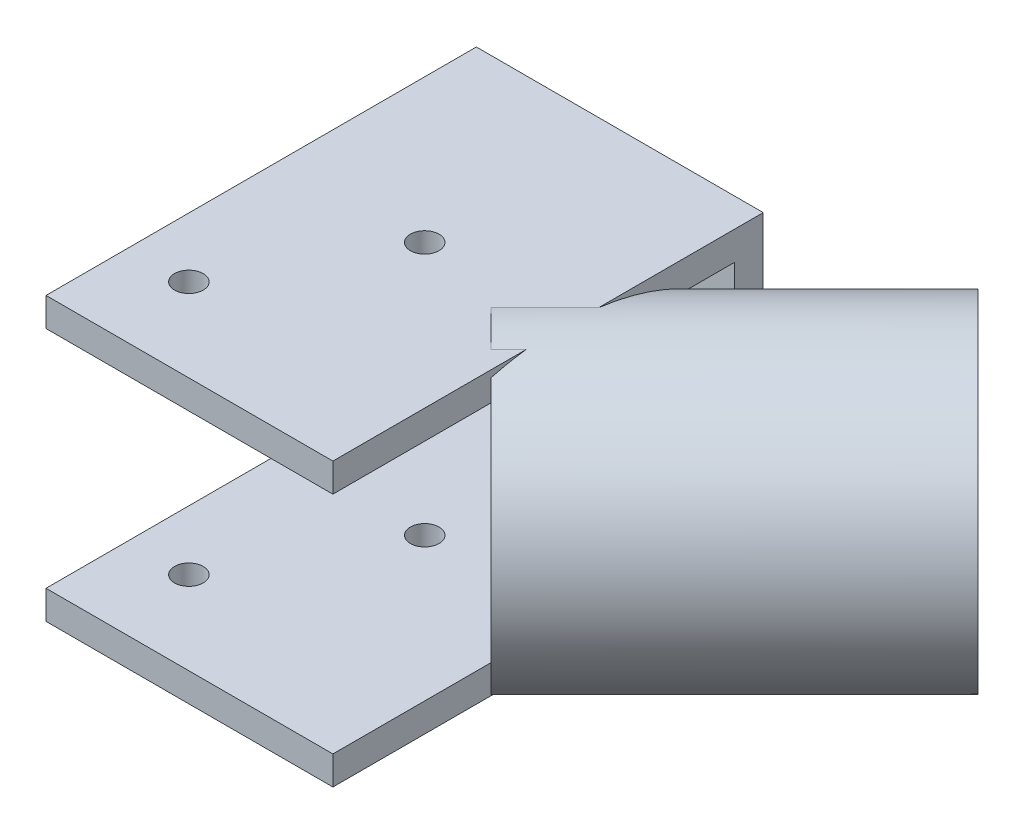
ISO-10303-21;
HEADER;
FILE_DESCRIPTION(('STEP AP214'),'2;1');
FILE_NAME('part.step','',(''),(''),'','','');
FILE_SCHEMA(('AUTOMOTIVE_DESIGN { 1 0 10303 214 1 1 1 1 }'));
ENDSEC;
DATA;
#1=APPLICATION_CONTEXT('core data for automotive mechanical design processes');
#2=APPLICATION_PROTOCOL_DEFINITION('international standard','automotive_design',2000,#1);
#3=PRODUCT_CONTEXT('',#1,'mechanical');
#4=PRODUCT('Part','Part','',(#3));
#5=PRODUCT_RELATED_PRODUCT_CATEGORY('part','',(#4));
#6=PRODUCT_DEFINITION_FORMATION('','',#4);
#7=PRODUCT_DEFINITION_CONTEXT('part definition',#1,'design');
#8=PRODUCT_DEFINITION('design','',#6,#7);
#9=PRODUCT_DEFINITION_SHAPE('','',#8);
#10=(LENGTH_UNIT() NAMED_UNIT(*) SI_UNIT(.MILLI.,.METRE.));
#11=(NAMED_UNIT(*) PLANE_ANGLE_UNIT() SI_UNIT($,.RADIAN.));
#12=(NAMED_UNIT(*) SI_UNIT($,.STERADIAN.) SOLID_ANGLE_UNIT());
#13=UNCERTAINTY_MEASURE_WITH_UNIT(LENGTH_MEASURE(1.E-05),#10,'distance_accuracy_value','');
#14=(GEOMETRIC_REPRESENTATION_CONTEXT(3) GLOBAL_UNCERTAINTY_ASSIGNED_CONTEXT((#13)) GLOBAL_UNIT_ASSIGNED_CONTEXT((#10,
#11,#12)) REPRESENTATION_CONTEXT('',''));
#15=CARTESIAN_POINT('',(0.,0.,0.));
#16=DIRECTION('',(0.,0.,1.));
#17=DIRECTION('',(1.,0.,0.));
#18=AXIS2_PLACEMENT_3D('',#15,#16,#17);
#19=CARTESIAN_POINT('',(43.7961985270279,24.6,41.2226053982207));
#20=DIRECTION('',(-0.707106781186547,0.,0.707106781186548));
#21=DIRECTION('',(0.707106781186548,0.,0.707106781186547));
#22=AXIS2_PLACEMENT_3D('',#19,#20,#21);
#23=PLANE('',#22);
#24=DIRECTION('',(0.,1.,0.));
#25=VECTOR('',#24,1.);
#26=CARTESIAN_POINT('',(50.,0.,47.4264068711929));
#27=LINE('',#26,#25);
#28=CARTESIAN_POINT('',(50.,44.2,47.4264068711929));
#29=VERTEX_POINT('',#28);
#30=CARTESIAN_POINT('',(50.,48.0099486237774,47.4264068711929));
#31=VERTEX_POINT('',#30);
#32=EDGE_CURVE('E186',#29,#31,#27,.T.);
#33=ORIENTED_EDGE('',*,*,#32,.F.);
#34=DIRECTION('',(0.,-1.,0.));
#35=VECTOR('',#34,1.);
#36=CARTESIAN_POINT('',(50.,24.6,47.4264068711929));
#37=LINE('',#36,#35);
#38=CARTESIAN_POINT('',(50.,36.7665810550005,47.4264068711928));
#39=VERTEX_POINT('',#38);
#40=EDGE_CURVE('E174',#29,#39,#37,.T.);
#41=ORIENTED_EDGE('',*,*,#40,.T.);
#42=CARTESIAN_POINT('',(43.7961985270279,24.6,41.2226053982207));
#43=DIRECTION('',(-0.707106781186547,0.,0.707106781186548));
#44=DIRECTION('',(0.707106781186548,0.,0.707106781186547));
#45=AXIS2_PLACEMENT_3D('',#42,#43,#44);
#46=CIRCLE('',#45,15.);
#47=CARTESIAN_POINT('',(50.,12.4334189449995,47.4264068711928));
#48=VERTEX_POINT('',#47);
#49=EDGE_CURVE('E173',#48,#39,#46,.T.);
#50=ORIENTED_EDGE('',*,*,#49,.F.);
#51=CARTESIAN_POINT('',(50.,5.,47.4264068711929));
#52=VERTEX_POINT('',#51);
#53=EDGE_CURVE('E47',#48,#52,#37,.T.);
#54=ORIENTED_EDGE('',*,*,#53,.T.);
#55=CARTESIAN_POINT('',(50.,1.19005137622258,47.4264068711929));
#56=VERTEX_POINT('',#55);
#57=EDGE_CURVE('E169',#56,#52,#27,.T.);
#58=ORIENTED_EDGE('',*,*,#57,.F.);
#59=CARTESIAN_POINT('',(43.7961985270279,24.6,41.2226053982207));
#60=DIRECTION('',(-0.707106781186547,0.,0.707106781186548));
#61=DIRECTION('',(0.707106781186548,0.,0.707106781186547));
#62=AXIS2_PLACEMENT_3D('',#59,#60,#61);
#63=CIRCLE('',#62,25.);
#64=EDGE_CURVE('E340',#56,#31,#63,.T.);
#65=ORIENTED_EDGE('',*,*,#64,.T.);
#66=EDGE_LOOP('',(#33,#41,#50,#54,#58,#65));
#67=FACE_BOUND('',#66,.T.);
#68=ADVANCED_FACE('F32',(#67),#23,.T.);
#69=CARTESIAN_POINT('',(43.7961985270279,24.6,41.2226053982207));
#70=DIRECTION('',(0.707106781186547,0.,-0.707106781186548));
#71=DIRECTION('',(-0.707106781186548,0.,-0.707106781186547));
#72=AXIS2_PLACEMENT_3D('',#69,#70,#71);
#73=CYLINDRICAL_SURFACE('',#72,25.);
#74=CARTESIAN_POINT('',(86.2226053982207,24.6,-1.20380147297211));
#75=DIRECTION('',(-0.707106781186547,0.,0.707106781186548));
#76=DIRECTION('',(0.707106781186548,0.,0.707106781186547));
#77=AXIS2_PLACEMENT_3D('',#74,#75,#76);
#78=CIRCLE('',#77,25.);
#79=CARTESIAN_POINT('',(103.900274927884,24.6,16.4738680566916));
#80=VERTEX_POINT('',#79);
#81=EDGE_CURVE('E382',#80,#80,#78,.T.);
#82=ORIENTED_EDGE('',*,*,#81,.T.);
#83=EDGE_LOOP('',(#82));
#84=FACE_BOUND('',#83,.T.);
#85=CARTESIAN_POINT('',(50.,24.6,35.0188039252486));
#86=DIRECTION('',(-1.,0.,0.));
#87=DIRECTION('',(0.,0.,-1.));
#88=AXIS2_PLACEMENT_3D('',#85,#86,#87);
#89=ELLIPSE('',#88,35.3553390593274,25.);
#90=CARTESIAN_POINT('',(50.,11.3925889952368,5.));
#91=VERTEX_POINT('',#90);
#92=CARTESIAN_POINT('',(50.,5.,13.0715945354424));
#93=VERTEX_POINT('',#92);
#94=EDGE_CURVE('E157',#91,#93,#89,.T.);
#95=ORIENTED_EDGE('',*,*,#94,.F.);
#96=CARTESIAN_POINT('',(50.,24.6,35.0188039252486));
#97=DIRECTION('',(-1.,0.,0.));
#98=DIRECTION('',(0.,0.,-1.));
#99=AXIS2_PLACEMENT_3D('',#96,#97,#98);
#100=ELLIPSE('',#99,35.3553390593274,25.);
#101=CARTESIAN_POINT('',(50.,21.1588249357965,0.));
#102=VERTEX_POINT('',#101);
#103=EDGE_CURVE('E359',#91,#102,#100,.F.);
#104=ORIENTED_EDGE('',*,*,#103,.T.);
#105=CARTESIAN_POINT('',(85.0188039252486,24.6,0.));
#106=DIRECTION('',(0.,0.,-1.));
#107=DIRECTION('',(1.,0.,0.));
#108=AXIS2_PLACEMENT_3D('',#105,#106,#107);
#109=ELLIPSE('',#108,35.3553390593274,25.);
#110=CARTESIAN_POINT('',(50.,28.0411750642035,0.));
#111=VERTEX_POINT('',#110);
#112=EDGE_CURVE('E363',#111,#102,#109,.F.);
#113=ORIENTED_EDGE('',*,*,#112,.F.);
#114=CARTESIAN_POINT('',(50.,37.8074110047632,5.));
#115=VERTEX_POINT('',#114);
#116=EDGE_CURVE('E346',#111,#115,#100,.F.);
#117=ORIENTED_EDGE('',*,*,#116,.T.);
#118=CARTESIAN_POINT('',(50.,44.2,13.0715945354424));
#119=VERTEX_POINT('',#118);
#120=EDGE_CURVE('E389',#119,#115,#89,.T.);
#121=ORIENTED_EDGE('',*,*,#120,.F.);
#122=CARTESIAN_POINT('',(50.,49.2,28.7195976260391));
#123=VERTEX_POINT('',#122);
#124=EDGE_CURVE('E352',#119,#123,#100,.F.);
#125=ORIENTED_EDGE('',*,*,#124,.T.);
#126=DIRECTION('',(0.707106781186547,0.,-0.707106781186548));
#127=VECTOR('',#126,1.);
#128=CARTESIAN_POINT('',(40.6465953774231,49.2,38.073002248616));
#129=LINE('',#128,#127);
#130=CARTESIAN_POINT('',(40.6465953774231,49.2,38.073002248616));
#131=VERTEX_POINT('',#130);
#132=EDGE_CURVE('E358',#123,#131,#129,.F.);
#133=ORIENTED_EDGE('',*,*,#132,.T.);
#134=CARTESIAN_POINT('',(46.9458016766327,49.2,44.3722085478255));
#135=VERTEX_POINT('',#134);
#136=EDGE_CURVE('E351',#135,#131,#63,.T.);
#137=ORIENTED_EDGE('',*,*,#136,.F.);
#138=DIRECTION('',(0.707106781186547,0.,-0.707106781186548));
#139=VECTOR('',#138,1.);
#140=CARTESIAN_POINT('',(46.9458016766327,49.2,44.3722085478255));
#141=LINE('',#140,#139);
#142=CARTESIAN_POINT('',(50.,49.2,41.3180102244582));
#143=VERTEX_POINT('',#142);
#144=EDGE_CURVE('E345',#135,#143,#141,.T.);
#145=ORIENTED_EDGE('',*,*,#144,.T.);
#146=EDGE_CURVE('E341',#143,#31,#100,.F.);
#147=ORIENTED_EDGE('',*,*,#146,.T.);
#148=ORIENTED_EDGE('',*,*,#64,.F.);
#149=CARTESIAN_POINT('',(50.,0.,41.3180102244581));
#150=VERTEX_POINT('',#149);
#151=EDGE_CURVE('E185',#56,#150,#100,.F.);
#152=ORIENTED_EDGE('',*,*,#151,.T.);
#153=DIRECTION('',(0.707106781186547,0.,-0.707106781186548));
#154=VECTOR('',#153,1.);
#155=CARTESIAN_POINT('',(46.9458016766326,0.,44.3722085478255));
#156=LINE('',#155,#154);
#157=CARTESIAN_POINT('',(46.9458016766326,0.,44.3722085478255));
#158=VERTEX_POINT('',#157);
#159=EDGE_CURVE('E187',#150,#158,#156,.F.);
#160=ORIENTED_EDGE('',*,*,#159,.T.);
#161=CARTESIAN_POINT('',(40.6465953774232,0.,38.073002248616));
#162=VERTEX_POINT('',#161);
#163=EDGE_CURVE('E355',#162,#158,#63,.T.);
#164=ORIENTED_EDGE('',*,*,#163,.F.);
#165=DIRECTION('',(0.707106781186547,0.,-0.707106781186548));
#166=VECTOR('',#165,1.);
#167=CARTESIAN_POINT('',(40.6465953774232,0.,38.073002248616));
#168=LINE('',#167,#166);
#169=CARTESIAN_POINT('',(50.,0.,28.7195976260392));
#170=VERTEX_POINT('',#169);
#171=EDGE_CURVE('E350',#162,#170,#168,.T.);
#172=ORIENTED_EDGE('',*,*,#171,.T.);
#173=EDGE_CURVE('E343',#170,#93,#100,.F.);
#174=ORIENTED_EDGE('',*,*,#173,.T.);
#175=EDGE_LOOP('',(#95,#104,#113,#117,#121,#125,#133,#137,#145,#147,#148,#152,#160,#164,#172,#174));
#176=FACE_BOUND('',#175,.T.);
#177=ADVANCED_FACE('F336',(#84,#176),#73,.T.);
#178=CARTESIAN_POINT('',(43.7961985270279,24.6,41.2226053982207));
#179=DIRECTION('',(0.707106781186547,0.,-0.707106781186548));
#180=DIRECTION('',(-0.707106781186548,0.,-0.707106781186547));
#181=AXIS2_PLACEMENT_3D('',#178,#179,#180);
#182=CYLINDRICAL_SURFACE('',#181,15.);
#183=CARTESIAN_POINT('',(86.2226053982207,24.6,-1.20380147297211));
#184=DIRECTION('',(-0.707106781186547,0.,0.707106781186548));
#185=DIRECTION('',(0.707106781186548,0.,0.707106781186547));
#186=AXIS2_PLACEMENT_3D('',#183,#184,#185);
#187=CIRCLE('',#186,15.);
#188=CARTESIAN_POINT('',(96.8292071160189,24.6,9.4028002448261));
#189=VERTEX_POINT('',#188);
#190=EDGE_CURVE('E385',#189,#189,#187,.T.);
#191=ORIENTED_EDGE('',*,*,#190,.F.);
#192=EDGE_LOOP('',(#191));
#193=FACE_BOUND('',#192,.T.);
#194=ORIENTED_EDGE('',*,*,#49,.T.);
#195=CARTESIAN_POINT('',(50.,24.6,35.0188039252486));
#196=DIRECTION('',(-1.,0.,0.));
#197=DIRECTION('',(0.,0.,-1.));
#198=AXIS2_PLACEMENT_3D('',#195,#196,#197);
#199=ELLIPSE('',#198,21.2132034355964,15.);
#200=EDGE_CURVE('E11',#39,#48,#199,.T.);
#201=ORIENTED_EDGE('',*,*,#200,.T.);
#202=EDGE_LOOP('',(#194,#201));
#203=FACE_BOUND('',#202,.T.);
#204=ADVANCED_FACE('F426',(#193,#203),#182,.F.);
#205=CARTESIAN_POINT('',(0.,0.,5.));
#206=DIRECTION('',(0.,1.,0.));
#207=DIRECTION('',(0.,0.,1.));
#208=AXIS2_PLACEMENT_3D('',#205,#206,#207);
#209=PLANE('',#208);
#210=CARTESIAN_POINT('',(25.,0.,34.));
#211=DIRECTION('',(0.,1.,0.));
#212=DIRECTION('',(0.,0.,1.));
#213=AXIS2_PLACEMENT_3D('',#210,#211,#212);
#214=CIRCLE('',#213,2.5);
#215=CARTESIAN_POINT('',(25.,0.,36.5));
#216=VERTEX_POINT('',#215);
#217=EDGE_CURVE('E280',#216,#216,#214,.T.);
#218=ORIENTED_EDGE('',*,*,#217,.T.);
#219=EDGE_LOOP('',(#218));
#220=FACE_BOUND('',#219,.T.);
#221=CARTESIAN_POINT('',(10.4,0.,60.5));
#222=DIRECTION('',(0.,-1.,0.));
#223=DIRECTION('',(0.,0.,-1.));
#224=AXIS2_PLACEMENT_3D('',#221,#222,#223);
#225=CIRCLE('',#224,2.5);
#226=CARTESIAN_POINT('',(10.4,0.,58.));
#227=VERTEX_POINT('',#226);
#228=EDGE_CURVE('E267',#227,#227,#225,.T.);
#229=ORIENTED_EDGE('',*,*,#228,.F.);
#230=EDGE_LOOP('',(#229));
#231=FACE_BOUND('',#230,.T.);
#232=ORIENTED_EDGE('',*,*,#159,.F.);
#233=DIRECTION('',(0.,0.,-1.));
#234=VECTOR('',#233,1.);
#235=CARTESIAN_POINT('',(50.,0.,5.));
#236=LINE('',#235,#234);
#237=CARTESIAN_POINT('',(50.,0.,75.));
#238=VERTEX_POINT('',#237);
#239=EDGE_CURVE('E245',#238,#150,#236,.T.);
#240=ORIENTED_EDGE('',*,*,#239,.F.);
#241=DIRECTION('',(1.,0.,0.));
#242=VECTOR('',#241,1.);
#243=CARTESIAN_POINT('',(0.,0.,75.));
#244=LINE('',#243,#242);
#245=CARTESIAN_POINT('',(0.,0.,75.));
#246=VERTEX_POINT('',#245);
#247=EDGE_CURVE('E318',#246,#238,#244,.T.);
#248=ORIENTED_EDGE('',*,*,#247,.F.);
#249=DIRECTION('',(0.,0.,-1.));
#250=VECTOR('',#249,1.);
#251=CARTESIAN_POINT('',(0.,0.,5.));
#252=LINE('',#251,#250);
#253=CARTESIAN_POINT('',(0.,0.,0.));
#254=VERTEX_POINT('',#253);
#255=EDGE_CURVE('E40',#246,#254,#252,.T.);
#256=ORIENTED_EDGE('',*,*,#255,.T.);
#257=DIRECTION('',(1.,0.,0.));
#258=VECTOR('',#257,1.);
#259=CARTESIAN_POINT('',(0.,0.,0.));
#260=LINE('',#259,#258);
#261=CARTESIAN_POINT('',(50.,0.,0.));
#262=VERTEX_POINT('',#261);
#263=EDGE_CURVE('E230',#254,#262,#260,.T.);
#264=ORIENTED_EDGE('',*,*,#263,.T.);
#265=EDGE_CURVE('E244',#170,#262,#236,.T.);
#266=ORIENTED_EDGE('',*,*,#265,.F.);
#267=ORIENTED_EDGE('',*,*,#171,.F.);
#268=DIRECTION('',(0.707106781186548,0.,0.707106781186547));
#269=VECTOR('',#268,1.);
#270=CARTESIAN_POINT('',(3.78679656440357,0.,1.21320343559643));
#271=LINE('',#270,#269);
#272=EDGE_CURVE('E54',#162,#158,#271,.T.);
#273=ORIENTED_EDGE('',*,*,#272,.T.);
#274=EDGE_LOOP('',(#232,#240,#248,#256,#264,#266,#267,#273));
#275=FACE_BOUND('',#274,.T.);
#276=ADVANCED_FACE('F432',(#220,#231,#275),#209,.F.);
#277=CARTESIAN_POINT('',(50.,0.,5.));
#278=DIRECTION('',(-1.,0.,0.));
#279=DIRECTION('',(0.,-1.,0.));
#280=AXIS2_PLACEMENT_3D('',#277,#278,#279);
#281=PLANE('',#280);
#282=DIRECTION('',(0.,0.,-1.));
#283=VECTOR('',#282,1.);
#284=CARTESIAN_POINT('',(50.,44.2,75.));
#285=LINE('',#284,#283);
#286=CARTESIAN_POINT('',(50.,44.2,75.));
#287=VERTEX_POINT('',#286);
#288=EDGE_CURVE('E213',#287,#29,#285,.T.);
#289=ORIENTED_EDGE('',*,*,#288,.T.);
#290=ORIENTED_EDGE('',*,*,#32,.T.);
#291=ORIENTED_EDGE('',*,*,#146,.F.);
#292=DIRECTION('',(0.,0.,-1.));
#293=VECTOR('',#292,1.);
#294=CARTESIAN_POINT('',(50.,49.2,5.));
#295=LINE('',#294,#293);
#296=CARTESIAN_POINT('',(50.,49.2,75.));
#297=VERTEX_POINT('',#296);
#298=EDGE_CURVE('E241',#297,#143,#295,.T.);
#299=ORIENTED_EDGE('',*,*,#298,.F.);
#300=DIRECTION('',(0.,1.,0.));
#301=VECTOR('',#300,1.);
#302=CARTESIAN_POINT('',(50.,49.2,75.));
#303=LINE('',#302,#301);
#304=EDGE_CURVE('E206',#287,#297,#303,.T.);
#305=ORIENTED_EDGE('',*,*,#304,.F.);
#306=EDGE_LOOP('',(#289,#290,#291,#299,#305));
#307=FACE_BOUND('',#306,.T.);
#308=ADVANCED_FACE('F378',(#307),#281,.F.);
#309=ORIENTED_EDGE('',*,*,#151,.F.);
#310=ORIENTED_EDGE('',*,*,#57,.T.);
#311=DIRECTION('',(0.,0.,-1.));
#312=VECTOR('',#311,1.);
#313=CARTESIAN_POINT('',(50.,5.,75.));
#314=LINE('',#313,#312);
#315=CARTESIAN_POINT('',(50.,5.,75.));
#316=VERTEX_POINT('',#315);
#317=EDGE_CURVE('E181',#316,#52,#314,.T.);
#318=ORIENTED_EDGE('',*,*,#317,.F.);
#319=DIRECTION('',(0.,1.,0.));
#320=VECTOR('',#319,1.);
#321=CARTESIAN_POINT('',(50.,0.,75.));
#322=LINE('',#321,#320);
#323=EDGE_CURVE('E321',#238,#316,#322,.T.);
#324=ORIENTED_EDGE('',*,*,#323,.F.);
#325=ORIENTED_EDGE('',*,*,#239,.T.);
#326=EDGE_LOOP('',(#309,#310,#318,#324,#325));
#327=FACE_BOUND('',#326,.T.);
#328=ADVANCED_FACE('F179',(#327),#281,.F.);
#329=ORIENTED_EDGE('',*,*,#116,.F.);
#330=DIRECTION('',(0.,1.,0.));
#331=VECTOR('',#330,1.);
#332=CARTESIAN_POINT('',(50.,0.,0.));
#333=LINE('',#332,#331);
#334=CARTESIAN_POINT('',(50.,49.2,0.));
#335=VERTEX_POINT('',#334);
#336=EDGE_CURVE('E233',#111,#335,#333,.T.);
#337=ORIENTED_EDGE('',*,*,#336,.T.);
#338=EDGE_CURVE('E240',#123,#335,#295,.T.);
#339=ORIENTED_EDGE('',*,*,#338,.F.);
#340=ORIENTED_EDGE('',*,*,#124,.F.);
#341=CARTESIAN_POINT('',(50.,44.2,5.));
#342=VERTEX_POINT('',#341);
#343=EDGE_CURVE('E211',#119,#342,#285,.T.);
#344=ORIENTED_EDGE('',*,*,#343,.T.);
#345=DIRECTION('',(0.,1.,0.));
#346=VECTOR('',#345,1.);
#347=CARTESIAN_POINT('',(50.,0.,5.));
#348=LINE('',#347,#346);
#349=EDGE_CURVE('E222',#115,#342,#348,.T.);
#350=ORIENTED_EDGE('',*,*,#349,.F.);
#351=EDGE_LOOP('',(#329,#337,#339,#340,#344,#350));
#352=FACE_BOUND('',#351,.T.);
#353=ADVANCED_FACE('F403',(#352),#281,.F.);
#354=CARTESIAN_POINT('',(0.,49.2,5.));
#355=DIRECTION('',(0.,-1.,0.));
#356=DIRECTION('',(1.,0.,0.));
#357=AXIS2_PLACEMENT_3D('',#354,#355,#356);
#358=PLANE('',#357);
#359=CARTESIAN_POINT('',(25.,49.2,34.));
#360=DIRECTION('',(0.,-1.,0.));
#361=DIRECTION('',(0.,0.,-1.));
#362=AXIS2_PLACEMENT_3D('',#359,#360,#361);
#363=CIRCLE('',#362,2.5);
#364=CARTESIAN_POINT('',(25.,49.2,31.5));
#365=VERTEX_POINT('',#364);
#366=EDGE_CURVE('E257',#365,#365,#363,.T.);
#367=ORIENTED_EDGE('',*,*,#366,.T.);
#368=EDGE_LOOP('',(#367));
#369=FACE_BOUND('',#368,.T.);
#370=CARTESIAN_POINT('',(10.4,49.2,60.5));
#371=DIRECTION('',(0.,-1.,0.));
#372=DIRECTION('',(0.,0.,-1.));
#373=AXIS2_PLACEMENT_3D('',#370,#371,#372);
#374=CIRCLE('',#373,2.5);
#375=CARTESIAN_POINT('',(10.4,49.2,58.));
#376=VERTEX_POINT('',#375);
#377=EDGE_CURVE('E261',#376,#376,#374,.T.);
#378=ORIENTED_EDGE('',*,*,#377,.T.);
#379=EDGE_LOOP('',(#378));
#380=FACE_BOUND('',#379,.T.);
#381=ORIENTED_EDGE('',*,*,#132,.F.);
#382=ORIENTED_EDGE('',*,*,#338,.T.);
#383=DIRECTION('',(-1.,0.,0.));
#384=VECTOR('',#383,1.);
#385=CARTESIAN_POINT('',(0.,49.2,0.));
#386=LINE('',#385,#384);
#387=CARTESIAN_POINT('',(0.,49.2,0.));
#388=VERTEX_POINT('',#387);
#389=EDGE_CURVE('E223',#335,#388,#386,.T.);
#390=ORIENTED_EDGE('',*,*,#389,.T.);
#391=DIRECTION('',(0.,0.,-1.));
#392=VECTOR('',#391,1.);
#393=CARTESIAN_POINT('',(0.,49.2,5.));
#394=LINE('',#393,#392);
#395=CARTESIAN_POINT('',(0.,49.2,75.));
#396=VERTEX_POINT('',#395);
#397=EDGE_CURVE('E227',#396,#388,#394,.T.);
#398=ORIENTED_EDGE('',*,*,#397,.F.);
#399=DIRECTION('',(-1.,0.,0.));
#400=VECTOR('',#399,1.);
#401=CARTESIAN_POINT('',(0.,49.2,75.));
#402=LINE('',#401,#400);
#403=EDGE_CURVE('E209',#297,#396,#402,.T.);
#404=ORIENTED_EDGE('',*,*,#403,.F.);
#405=ORIENTED_EDGE('',*,*,#298,.T.);
#406=ORIENTED_EDGE('',*,*,#144,.F.);
#407=DIRECTION('',(-0.707106781186548,0.,-0.707106781186547));
#408=VECTOR('',#407,1.);
#409=CARTESIAN_POINT('',(3.78679656440357,49.2,1.21320343559643));
#410=LINE('',#409,#408);
#411=EDGE_CURVE('E374',#135,#131,#410,.T.);
#412=ORIENTED_EDGE('',*,*,#411,.T.);
#413=EDGE_LOOP('',(#381,#382,#390,#398,#404,#405,#406,#412));
#414=FACE_BOUND('',#413,.T.);
#415=ADVANCED_FACE('F406',(#369,#380,#414),#358,.F.);
#416=CARTESIAN_POINT('',(25.,24.6,0.));
#417=DIRECTION('',(0.,0.,1.));
#418=DIRECTION('',(1.,0.,0.));
#419=AXIS2_PLACEMENT_3D('',#416,#417,#418);
#420=CYLINDRICAL_SURFACE('',#419,10.);
#421=CARTESIAN_POINT('',(25.,24.6,5.));
#422=DIRECTION('',(0.,0.,1.));
#423=DIRECTION('',(1.,0.,0.));
#424=AXIS2_PLACEMENT_3D('',#421,#422,#423);
#425=CIRCLE('',#424,10.);
#426=CARTESIAN_POINT('',(35.,24.6,5.));
#427=VERTEX_POINT('',#426);
#428=EDGE_CURVE('E303',#427,#427,#425,.T.);
#429=ORIENTED_EDGE('',*,*,#428,.T.);
#430=EDGE_LOOP('',(#429));
#431=FACE_BOUND('',#430,.T.);
#432=CARTESIAN_POINT('',(25.,24.6,2.));
#433=DIRECTION('',(0.,0.,-1.));
#434=DIRECTION('',(-1.,0.,0.));
#435=AXIS2_PLACEMENT_3D('',#432,#433,#434);
#436=CIRCLE('',#435,10.);
#437=CARTESIAN_POINT('',(15.,24.6,2.));
#438=VERTEX_POINT('',#437);
#439=EDGE_CURVE('E249',#438,#438,#436,.F.);
#440=ORIENTED_EDGE('',*,*,#439,.F.);
#441=EDGE_LOOP('',(#440));
#442=FACE_BOUND('',#441,.T.);
#443=ADVANCED_FACE('F468',(#431,#442),#420,.F.);
#444=CARTESIAN_POINT('',(0.,0.,5.));
#445=DIRECTION('',(0.,0.,-1.));
#446=DIRECTION('',(-1.,0.,0.));
#447=AXIS2_PLACEMENT_3D('',#444,#445,#446);
#448=PLANE('',#447);
#449=CARTESIAN_POINT('',(50.,5.,5.));
#450=VERTEX_POINT('',#449);
#451=EDGE_CURVE('E224',#450,#91,#348,.T.);
#452=ORIENTED_EDGE('',*,*,#451,.T.);
#453=DIRECTION('',(0.,-1.,0.));
#454=VECTOR('',#453,1.);
#455=CARTESIAN_POINT('',(50.,44.2,5.));
#456=LINE('',#455,#454);
#457=EDGE_CURVE('E175',#115,#91,#456,.T.);
#458=ORIENTED_EDGE('',*,*,#457,.F.);
#459=ORIENTED_EDGE('',*,*,#349,.T.);
#460=DIRECTION('',(1.,0.,0.));
#461=VECTOR('',#460,1.);
#462=CARTESIAN_POINT('',(0.,44.2,5.));
#463=LINE('',#462,#461);
#464=CARTESIAN_POINT('',(0.,44.2,5.));
#465=VERTEX_POINT('',#464);
#466=EDGE_CURVE('E192',#465,#342,#463,.T.);
#467=ORIENTED_EDGE('',*,*,#466,.F.);
#468=DIRECTION('',(0.,-1.,0.));
#469=VECTOR('',#468,1.);
#470=CARTESIAN_POINT('',(0.,0.,5.));
#471=LINE('',#470,#469);
#472=CARTESIAN_POINT('',(0.,5.,5.));
#473=VERTEX_POINT('',#472);
#474=EDGE_CURVE('E220',#465,#473,#471,.T.);
#475=ORIENTED_EDGE('',*,*,#474,.T.);
#476=DIRECTION('',(-1.,0.,0.));
#477=VECTOR('',#476,1.);
#478=CARTESIAN_POINT('',(0.,5.,5.));
#479=LINE('',#478,#477);
#480=EDGE_CURVE('E314',#450,#473,#479,.T.);
#481=ORIENTED_EDGE('',*,*,#480,.F.);
#482=EDGE_LOOP('',(#452,#458,#459,#467,#475,#481));
#483=FACE_BOUND('',#482,.T.);
#484=CARTESIAN_POINT('',(9.3,8.90000000000001,5.));
#485=DIRECTION('',(0.,0.,1.));
#486=DIRECTION('',(1.,0.,0.));
#487=AXIS2_PLACEMENT_3D('',#484,#485,#486);
#488=CIRCLE('',#487,1.25);
#489=CARTESIAN_POINT('',(10.55,8.90000000000001,5.));
#490=VERTEX_POINT('',#489);
#491=EDGE_CURVE('E304',#490,#490,#488,.T.);
#492=ORIENTED_EDGE('',*,*,#491,.F.);
#493=EDGE_LOOP('',(#492));
#494=FACE_BOUND('',#493,.T.);
#495=CARTESIAN_POINT('',(40.7,40.3,5.));
#496=DIRECTION('',(0.,0.,1.));
#497=DIRECTION('',(1.,0.,0.));
#498=AXIS2_PLACEMENT_3D('',#495,#496,#497);
#499=CIRCLE('',#498,1.25);
#500=CARTESIAN_POINT('',(41.95,40.3,5.));
#501=VERTEX_POINT('',#500);
#502=EDGE_CURVE('E291',#501,#501,#499,.T.);
#503=ORIENTED_EDGE('',*,*,#502,.F.);
#504=EDGE_LOOP('',(#503));
#505=FACE_BOUND('',#504,.T.);
#506=CARTESIAN_POINT('',(40.7,8.90000000000001,5.));
#507=DIRECTION('',(0.,0.,1.));
#508=DIRECTION('',(1.,0.,0.));
#509=AXIS2_PLACEMENT_3D('',#506,#507,#508);
#510=CIRCLE('',#509,1.25);
#511=CARTESIAN_POINT('',(41.95,8.90000000000001,5.));
#512=VERTEX_POINT('',#511);
#513=EDGE_CURVE('E292',#512,#512,#510,.T.);
#514=ORIENTED_EDGE('',*,*,#513,.F.);
#515=EDGE_LOOP('',(#514));
#516=FACE_BOUND('',#515,.T.);
#517=CARTESIAN_POINT('',(9.3,40.3,5.));
#518=DIRECTION('',(0.,0.,1.));
#519=DIRECTION('',(1.,0.,0.));
#520=AXIS2_PLACEMENT_3D('',#517,#518,#519);
#521=CIRCLE('',#520,1.25);
#522=CARTESIAN_POINT('',(10.55,40.3,5.));
#523=VERTEX_POINT('',#522);
#524=EDGE_CURVE('E252',#523,#523,#521,.T.);
#525=ORIENTED_EDGE('',*,*,#524,.F.);
#526=EDGE_LOOP('',(#525));
#527=FACE_BOUND('',#526,.T.);
#528=ORIENTED_EDGE('',*,*,#428,.F.);
#529=EDGE_LOOP('',(#528));
#530=FACE_BOUND('',#529,.T.);
#531=ADVANCED_FACE('F471',(#483,#494,#505,#516,#527,#530),#448,.F.);
#532=CARTESIAN_POINT('',(0.,0.,5.));
#533=DIRECTION('',(1.,0.,0.));
#534=DIRECTION('',(0.,0.,-1.));
#535=AXIS2_PLACEMENT_3D('',#532,#533,#534);
#536=PLANE('',#535);
#537=DIRECTION('',(0.,-1.,0.));
#538=VECTOR('',#537,1.);
#539=CARTESIAN_POINT('',(0.,0.,0.));
#540=LINE('',#539,#538);
#541=EDGE_CURVE('E219',#388,#254,#540,.T.);
#542=ORIENTED_EDGE('',*,*,#541,.T.);
#543=ORIENTED_EDGE('',*,*,#255,.F.);
#544=DIRECTION('',(0.,-1.,0.));
#545=VECTOR('',#544,1.);
#546=CARTESIAN_POINT('',(0.,0.,75.));
#547=LINE('',#546,#545);
#548=CARTESIAN_POINT('',(0.,5.,75.));
#549=VERTEX_POINT('',#548);
#550=EDGE_CURVE('E315',#549,#246,#547,.T.);
#551=ORIENTED_EDGE('',*,*,#550,.F.);
#552=DIRECTION('',(0.,0.,-1.));
#553=VECTOR('',#552,1.);
#554=CARTESIAN_POINT('',(0.,5.,75.));
#555=LINE('',#554,#553);
#556=EDGE_CURVE('E198',#549,#473,#555,.T.);
#557=ORIENTED_EDGE('',*,*,#556,.T.);
#558=ORIENTED_EDGE('',*,*,#474,.F.);
#559=DIRECTION('',(0.,0.,-1.));
#560=VECTOR('',#559,1.);
#561=CARTESIAN_POINT('',(0.,44.2,75.));
#562=LINE('',#561,#560);
#563=CARTESIAN_POINT('',(0.,44.2,75.));
#564=VERTEX_POINT('',#563);
#565=EDGE_CURVE('E216',#564,#465,#562,.T.);
#566=ORIENTED_EDGE('',*,*,#565,.F.);
#567=DIRECTION('',(0.,-1.,0.));
#568=VECTOR('',#567,1.);
#569=CARTESIAN_POINT('',(0.,49.2,75.));
#570=LINE('',#569,#568);
#571=EDGE_CURVE('E196',#396,#564,#570,.T.);
#572=ORIENTED_EDGE('',*,*,#571,.F.);
#573=ORIENTED_EDGE('',*,*,#397,.T.);
#574=EDGE_LOOP('',(#542,#543,#551,#557,#558,#566,#572,#573));
#575=FACE_BOUND('',#574,.T.);
#576=ADVANCED_FACE('F34',(#575),#536,.F.);
#577=ORIENTED_EDGE('',*,*,#173,.F.);
#578=ORIENTED_EDGE('',*,*,#265,.T.);
#579=EDGE_CURVE('E234',#262,#102,#333,.T.);
#580=ORIENTED_EDGE('',*,*,#579,.T.);
#581=ORIENTED_EDGE('',*,*,#103,.F.);
#582=ORIENTED_EDGE('',*,*,#451,.F.);
#583=EDGE_CURVE('E193',#93,#450,#314,.T.);
#584=ORIENTED_EDGE('',*,*,#583,.F.);
#585=EDGE_LOOP('',(#577,#578,#580,#581,#582,#584));
#586=FACE_BOUND('',#585,.T.);
#587=ADVANCED_FACE('F488',(#586),#281,.F.);
#588=CARTESIAN_POINT('',(0.,0.,0.));
#589=DIRECTION('',(0.,0.,-1.));
#590=DIRECTION('',(-1.,0.,0.));
#591=AXIS2_PLACEMENT_3D('',#588,#589,#590);
#592=PLANE('',#591);
#593=CARTESIAN_POINT('',(25.,24.6,0.));
#594=DIRECTION('',(0.,0.,-1.));
#595=DIRECTION('',(-1.,0.,0.));
#596=AXIS2_PLACEMENT_3D('',#593,#594,#595);
#597=CIRCLE('',#596,11.);
#598=CARTESIAN_POINT('',(14.,24.6,0.));
#599=VERTEX_POINT('',#598);
#600=EDGE_CURVE('E283',#599,#599,#597,.T.);
#601=ORIENTED_EDGE('',*,*,#600,.F.);
#602=EDGE_LOOP('',(#601));
#603=FACE_BOUND('',#602,.T.);
#604=CARTESIAN_POINT('',(9.3,8.90000000000001,0.));
#605=DIRECTION('',(0.,0.,1.));
#606=DIRECTION('',(1.,0.,0.));
#607=AXIS2_PLACEMENT_3D('',#604,#605,#606);
#608=CIRCLE('',#607,1.25);
#609=CARTESIAN_POINT('',(10.55,8.90000000000001,0.));
#610=VERTEX_POINT('',#609);
#611=EDGE_CURVE('E300',#610,#610,#608,.T.);
#612=ORIENTED_EDGE('',*,*,#611,.T.);
#613=EDGE_LOOP('',(#612));
#614=FACE_BOUND('',#613,.T.);
#615=CARTESIAN_POINT('',(40.7,40.3,0.));
#616=DIRECTION('',(0.,0.,1.));
#617=DIRECTION('',(1.,0.,0.));
#618=AXIS2_PLACEMENT_3D('',#615,#616,#617);
#619=CIRCLE('',#618,1.25);
#620=CARTESIAN_POINT('',(41.95,40.3,0.));
#621=VERTEX_POINT('',#620);
#622=EDGE_CURVE('E307',#621,#621,#619,.T.);
#623=ORIENTED_EDGE('',*,*,#622,.T.);
#624=EDGE_LOOP('',(#623));
#625=FACE_BOUND('',#624,.T.);
#626=CARTESIAN_POINT('',(40.7,8.90000000000001,0.));
#627=DIRECTION('',(0.,0.,1.));
#628=DIRECTION('',(1.,0.,0.));
#629=AXIS2_PLACEMENT_3D('',#626,#627,#628);
#630=CIRCLE('',#629,1.25);
#631=CARTESIAN_POINT('',(41.95,8.90000000000001,0.));
#632=VERTEX_POINT('',#631);
#633=EDGE_CURVE('E288',#632,#632,#630,.T.);
#634=ORIENTED_EDGE('',*,*,#633,.T.);
#635=EDGE_LOOP('',(#634));
#636=FACE_BOUND('',#635,.T.);
#637=CARTESIAN_POINT('',(9.3,40.3,0.));
#638=DIRECTION('',(0.,0.,1.));
#639=DIRECTION('',(1.,0.,0.));
#640=AXIS2_PLACEMENT_3D('',#637,#638,#639);
#641=CIRCLE('',#640,1.25);
#642=CARTESIAN_POINT('',(10.55,40.3,0.));
#643=VERTEX_POINT('',#642);
#644=EDGE_CURVE('E295',#643,#643,#641,.T.);
#645=ORIENTED_EDGE('',*,*,#644,.T.);
#646=EDGE_LOOP('',(#645));
#647=FACE_BOUND('',#646,.T.);
#648=ORIENTED_EDGE('',*,*,#336,.F.);
#649=ORIENTED_EDGE('',*,*,#112,.T.);
#650=ORIENTED_EDGE('',*,*,#579,.F.);
#651=ORIENTED_EDGE('',*,*,#263,.F.);
#652=ORIENTED_EDGE('',*,*,#541,.F.);
#653=ORIENTED_EDGE('',*,*,#389,.F.);
#654=EDGE_LOOP('',(#648,#649,#650,#651,#652,#653));
#655=FACE_BOUND('',#654,.T.);
#656=ADVANCED_FACE('F483',(#603,#614,#625,#636,#647,#655),#592,.T.);
#657=CARTESIAN_POINT('',(0.,44.2,75.));
#658=DIRECTION('',(0.,1.,0.));
#659=DIRECTION('',(0.,0.,1.));
#660=AXIS2_PLACEMENT_3D('',#657,#658,#659);
#661=PLANE('',#660);
#662=DIRECTION('',(0.,0.,-1.));
#663=VECTOR('',#662,1.);
#664=CARTESIAN_POINT('',(50.,44.2,75.));
#665=LINE('',#664,#663);
#666=EDGE_CURVE('E161',#29,#119,#665,.T.);
#667=ORIENTED_EDGE('',*,*,#666,.F.);
#668=ORIENTED_EDGE('',*,*,#288,.F.);
#669=DIRECTION('',(1.,0.,0.));
#670=VECTOR('',#669,1.);
#671=CARTESIAN_POINT('',(0.,44.2,75.));
#672=LINE('',#671,#670);
#673=EDGE_CURVE('E204',#564,#287,#672,.T.);
#674=ORIENTED_EDGE('',*,*,#673,.F.);
#675=ORIENTED_EDGE('',*,*,#565,.T.);
#676=ORIENTED_EDGE('',*,*,#466,.T.);
#677=ORIENTED_EDGE('',*,*,#343,.F.);
#678=EDGE_LOOP('',(#667,#668,#674,#675,#676,#677));
#679=FACE_BOUND('',#678,.T.);
#680=CARTESIAN_POINT('',(10.4,44.2,60.5));
#681=DIRECTION('',(0.,1.,0.));
#682=DIRECTION('',(0.,0.,1.));
#683=AXIS2_PLACEMENT_3D('',#680,#681,#682);
#684=CIRCLE('',#683,2.5);
#685=CARTESIAN_POINT('',(10.4,44.2,63.));
#686=VERTEX_POINT('',#685);
#687=EDGE_CURVE('E260',#686,#686,#684,.T.);
#688=ORIENTED_EDGE('',*,*,#687,.T.);
#689=EDGE_LOOP('',(#688));
#690=FACE_BOUND('',#689,.T.);
#691=CARTESIAN_POINT('',(25.,44.2,34.));
#692=DIRECTION('',(0.,1.,0.));
#693=DIRECTION('',(0.,0.,1.));
#694=AXIS2_PLACEMENT_3D('',#691,#692,#693);
#695=CIRCLE('',#694,2.5);
#696=CARTESIAN_POINT('',(25.,44.2,36.5));
#697=VERTEX_POINT('',#696);
#698=EDGE_CURVE('E256',#697,#697,#695,.T.);
#699=ORIENTED_EDGE('',*,*,#698,.T.);
#700=EDGE_LOOP('',(#699));
#701=FACE_BOUND('',#700,.T.);
#702=ADVANCED_FACE('F399',(#679,#690,#701),#661,.F.);
#703=CARTESIAN_POINT('',(0.,0.,75.));
#704=DIRECTION('',(0.,0.,1.));
#705=DIRECTION('',(1.,0.,0.));
#706=AXIS2_PLACEMENT_3D('',#703,#704,#705);
#707=PLANE('',#706);
#708=ORIENTED_EDGE('',*,*,#571,.T.);
#709=ORIENTED_EDGE('',*,*,#673,.T.);
#710=ORIENTED_EDGE('',*,*,#304,.T.);
#711=ORIENTED_EDGE('',*,*,#403,.T.);
#712=EDGE_LOOP('',(#708,#709,#710,#711));
#713=FACE_BOUND('',#712,.T.);
#714=ADVANCED_FACE('F477',(#713),#707,.T.);
#715=CARTESIAN_POINT('',(0.,5.,75.));
#716=DIRECTION('',(0.,-1.,0.));
#717=DIRECTION('',(0.,0.,-1.));
#718=AXIS2_PLACEMENT_3D('',#715,#716,#717);
#719=PLANE('',#718);
#720=CARTESIAN_POINT('',(10.4,5.,60.5));
#721=DIRECTION('',(0.,-1.,0.));
#722=DIRECTION('',(0.,0.,-1.));
#723=AXIS2_PLACEMENT_3D('',#720,#721,#722);
#724=CIRCLE('',#723,2.5);
#725=CARTESIAN_POINT('',(10.4,5.,58.));
#726=VERTEX_POINT('',#725);
#727=EDGE_CURVE('E258',#726,#726,#724,.T.);
#728=ORIENTED_EDGE('',*,*,#727,.T.);
#729=EDGE_LOOP('',(#728));
#730=FACE_BOUND('',#729,.T.);
#731=CARTESIAN_POINT('',(25.,5.,34.));
#732=DIRECTION('',(0.,-1.,0.));
#733=DIRECTION('',(0.,0.,-1.));
#734=AXIS2_PLACEMENT_3D('',#731,#732,#733);
#735=CIRCLE('',#734,2.5);
#736=CARTESIAN_POINT('',(25.,5.,31.5));
#737=VERTEX_POINT('',#736);
#738=EDGE_CURVE('E254',#737,#737,#735,.T.);
#739=ORIENTED_EDGE('',*,*,#738,.T.);
#740=EDGE_LOOP('',(#739));
#741=FACE_BOUND('',#740,.T.);
#742=ORIENTED_EDGE('',*,*,#317,.T.);
#743=DIRECTION('',(0.,0.,-1.));
#744=VECTOR('',#743,1.);
#745=CARTESIAN_POINT('',(50.,5.,75.));
#746=LINE('',#745,#744);
#747=EDGE_CURVE('E154',#52,#93,#746,.T.);
#748=ORIENTED_EDGE('',*,*,#747,.T.);
#749=ORIENTED_EDGE('',*,*,#583,.T.);
#750=ORIENTED_EDGE('',*,*,#480,.T.);
#751=ORIENTED_EDGE('',*,*,#556,.F.);
#752=DIRECTION('',(-1.,0.,0.));
#753=VECTOR('',#752,1.);
#754=CARTESIAN_POINT('',(0.,5.,75.));
#755=LINE('',#754,#753);
#756=EDGE_CURVE('E191',#316,#549,#755,.T.);
#757=ORIENTED_EDGE('',*,*,#756,.F.);
#758=EDGE_LOOP('',(#742,#748,#749,#750,#751,#757));
#759=FACE_BOUND('',#758,.T.);
#760=ADVANCED_FACE('F189',(#730,#741,#759),#719,.F.);
#761=CARTESIAN_POINT('',(0.,0.,75.));
#762=DIRECTION('',(0.,0.,-1.));
#763=DIRECTION('',(-1.,0.,0.));
#764=AXIS2_PLACEMENT_3D('',#761,#762,#763);
#765=PLANE('',#764);
#766=ORIENTED_EDGE('',*,*,#550,.T.);
#767=ORIENTED_EDGE('',*,*,#247,.T.);
#768=ORIENTED_EDGE('',*,*,#323,.T.);
#769=ORIENTED_EDGE('',*,*,#756,.T.);
#770=EDGE_LOOP('',(#766,#767,#768,#769));
#771=FACE_BOUND('',#770,.T.);
#772=ADVANCED_FACE('F334',(#771),#765,.F.);
#773=CARTESIAN_POINT('',(9.3,40.3,0.));
#774=DIRECTION('',(0.,0.,1.));
#775=DIRECTION('',(1.,0.,0.));
#776=AXIS2_PLACEMENT_3D('',#773,#774,#775);
#777=CYLINDRICAL_SURFACE('',#776,1.25);
#778=ORIENTED_EDGE('',*,*,#644,.F.);
#779=EDGE_LOOP('',(#778));
#780=FACE_BOUND('',#779,.T.);
#781=ORIENTED_EDGE('',*,*,#524,.T.);
#782=EDGE_LOOP('',(#781));
#783=FACE_BOUND('',#782,.T.);
#784=ADVANCED_FACE('F457',(#780,#783),#777,.F.);
#785=CARTESIAN_POINT('',(40.7,8.90000000000001,0.));
#786=DIRECTION('',(0.,0.,1.));
#787=DIRECTION('',(1.,0.,0.));
#788=AXIS2_PLACEMENT_3D('',#785,#786,#787);
#789=CYLINDRICAL_SURFACE('',#788,1.25);
#790=ORIENTED_EDGE('',*,*,#633,.F.);
#791=EDGE_LOOP('',(#790));
#792=FACE_BOUND('',#791,.T.);
#793=ORIENTED_EDGE('',*,*,#513,.T.);
#794=EDGE_LOOP('',(#793));
#795=FACE_BOUND('',#794,.T.);
#796=ADVANCED_FACE('F453',(#792,#795),#789,.F.);
#797=CARTESIAN_POINT('',(40.7,40.3,0.));
#798=DIRECTION('',(0.,0.,1.));
#799=DIRECTION('',(1.,0.,0.));
#800=AXIS2_PLACEMENT_3D('',#797,#798,#799);
#801=CYLINDRICAL_SURFACE('',#800,1.25);
#802=ORIENTED_EDGE('',*,*,#622,.F.);
#803=EDGE_LOOP('',(#802));
#804=FACE_BOUND('',#803,.T.);
#805=ORIENTED_EDGE('',*,*,#502,.T.);
#806=EDGE_LOOP('',(#805));
#807=FACE_BOUND('',#806,.T.);
#808=ADVANCED_FACE('F456',(#804,#807),#801,.F.);
#809=CARTESIAN_POINT('',(9.3,8.90000000000001,0.));
#810=DIRECTION('',(0.,0.,1.));
#811=DIRECTION('',(1.,0.,0.));
#812=AXIS2_PLACEMENT_3D('',#809,#810,#811);
#813=CYLINDRICAL_SURFACE('',#812,1.25);
#814=ORIENTED_EDGE('',*,*,#611,.F.);
#815=EDGE_LOOP('',(#814));
#816=FACE_BOUND('',#815,.T.);
#817=ORIENTED_EDGE('',*,*,#491,.T.);
#818=EDGE_LOOP('',(#817));
#819=FACE_BOUND('',#818,.T.);
#820=ADVANCED_FACE('F448',(#816,#819),#813,.F.);
#821=CARTESIAN_POINT('',(25.,24.6,2.));
#822=DIRECTION('',(0.,0.,-1.));
#823=DIRECTION('',(-1.,0.,0.));
#824=AXIS2_PLACEMENT_3D('',#821,#822,#823);
#825=PLANE('',#824);
#826=CARTESIAN_POINT('',(25.,24.6,2.));
#827=DIRECTION('',(0.,0.,-1.));
#828=DIRECTION('',(-1.,0.,0.));
#829=AXIS2_PLACEMENT_3D('',#826,#827,#828);
#830=CIRCLE('',#829,11.);
#831=CARTESIAN_POINT('',(14.,24.6,2.));
#832=VERTEX_POINT('',#831);
#833=EDGE_CURVE('E253',#832,#832,#830,.T.);
#834=ORIENTED_EDGE('',*,*,#833,.T.);
#835=EDGE_LOOP('',(#834));
#836=FACE_BOUND('',#835,.T.);
#837=ORIENTED_EDGE('',*,*,#439,.T.);
#838=EDGE_LOOP('',(#837));
#839=FACE_BOUND('',#838,.T.);
#840=ADVANCED_FACE('F445',(#836,#839),#825,.T.);
#841=CARTESIAN_POINT('',(25.,24.6,2.));
#842=DIRECTION('',(0.,0.,-1.));
#843=DIRECTION('',(-1.,0.,0.));
#844=AXIS2_PLACEMENT_3D('',#841,#842,#843);
#845=CYLINDRICAL_SURFACE('',#844,11.);
#846=ORIENTED_EDGE('',*,*,#833,.F.);
#847=EDGE_LOOP('',(#846));
#848=FACE_BOUND('',#847,.T.);
#849=ORIENTED_EDGE('',*,*,#600,.T.);
#850=EDGE_LOOP('',(#849));
#851=FACE_BOUND('',#850,.T.);
#852=ADVANCED_FACE('F443',(#848,#851),#845,.F.);
#853=CARTESIAN_POINT('',(25.,49.2,34.));
#854=DIRECTION('',(0.,-1.,0.));
#855=DIRECTION('',(0.,0.,-1.));
#856=AXIS2_PLACEMENT_3D('',#853,#854,#855);
#857=CYLINDRICAL_SURFACE('',#856,2.5);
#858=ORIENTED_EDGE('',*,*,#738,.F.);
#859=EDGE_LOOP('',(#858));
#860=FACE_BOUND('',#859,.T.);
#861=ORIENTED_EDGE('',*,*,#217,.F.);
#862=EDGE_LOOP('',(#861));
#863=FACE_BOUND('',#862,.T.);
#864=ADVANCED_FACE('F439',(#860,#863),#857,.F.);
#865=ORIENTED_EDGE('',*,*,#366,.F.);
#866=EDGE_LOOP('',(#865));
#867=FACE_BOUND('',#866,.T.);
#868=ORIENTED_EDGE('',*,*,#698,.F.);
#869=EDGE_LOOP('',(#868));
#870=FACE_BOUND('',#869,.T.);
#871=ADVANCED_FACE('F442',(#867,#870),#857,.F.);
#872=CARTESIAN_POINT('',(10.4,49.2,60.5));
#873=DIRECTION('',(0.,-1.,0.));
#874=DIRECTION('',(0.,0.,-1.));
#875=AXIS2_PLACEMENT_3D('',#872,#873,#874);
#876=CYLINDRICAL_SURFACE('',#875,2.5);
#877=ORIENTED_EDGE('',*,*,#228,.T.);
#878=EDGE_LOOP('',(#877));
#879=FACE_BOUND('',#878,.T.);
#880=ORIENTED_EDGE('',*,*,#727,.F.);
#881=EDGE_LOOP('',(#880));
#882=FACE_BOUND('',#881,.T.);
#883=ADVANCED_FACE('F437',(#879,#882),#876,.F.);
#884=ORIENTED_EDGE('',*,*,#377,.F.);
#885=EDGE_LOOP('',(#884));
#886=FACE_BOUND('',#885,.T.);
#887=ORIENTED_EDGE('',*,*,#687,.F.);
#888=EDGE_LOOP('',(#887));
#889=FACE_BOUND('',#888,.T.);
#890=ADVANCED_FACE('F419',(#886,#889),#876,.F.);
#891=ORIENTED_EDGE('',*,*,#272,.F.);
#892=ORIENTED_EDGE('',*,*,#163,.T.);
#893=EDGE_LOOP('',(#891,#892));
#894=FACE_BOUND('',#893,.T.);
#895=ADVANCED_FACE('F411',(#894),#23,.T.);
#896=ORIENTED_EDGE('',*,*,#411,.F.);
#897=ORIENTED_EDGE('',*,*,#136,.T.);
#898=EDGE_LOOP('',(#896,#897));
#899=FACE_BOUND('',#898,.T.);
#900=ADVANCED_FACE('F408',(#899),#23,.T.);
#901=CARTESIAN_POINT('',(86.2226053982207,24.6,-1.20380147297211));
#902=DIRECTION('',(-0.707106781186547,0.,0.707106781186548));
#903=DIRECTION('',(0.707106781186548,0.,0.707106781186547));
#904=AXIS2_PLACEMENT_3D('',#901,#902,#903);
#905=PLANE('',#904);
#906=ORIENTED_EDGE('',*,*,#81,.F.);
#907=EDGE_LOOP('',(#906));
#908=FACE_BOUND('',#907,.T.);
#909=ORIENTED_EDGE('',*,*,#190,.T.);
#910=EDGE_LOOP('',(#909));
#911=FACE_BOUND('',#910,.T.);
#912=ADVANCED_FACE('F410',(#908,#911),#905,.F.);
#913=CARTESIAN_POINT('',(50.,44.2,75.));
#914=DIRECTION('',(-1.,0.,0.));
#915=DIRECTION('',(0.,0.,1.));
#916=AXIS2_PLACEMENT_3D('',#913,#914,#915);
#917=PLANE('',#916);
#918=ORIENTED_EDGE('',*,*,#94,.T.);
#919=ORIENTED_EDGE('',*,*,#747,.F.);
#920=ORIENTED_EDGE('',*,*,#53,.F.);
#921=ORIENTED_EDGE('',*,*,#200,.F.);
#922=ORIENTED_EDGE('',*,*,#40,.F.);
#923=ORIENTED_EDGE('',*,*,#666,.T.);
#924=ORIENTED_EDGE('',*,*,#120,.T.);
#925=ORIENTED_EDGE('',*,*,#457,.T.);
#926=EDGE_LOOP('',(#918,#919,#920,#921,#922,#923,#924,#925));
#927=FACE_BOUND('',#926,.T.);
#928=ADVANCED_FACE('F155',(#927),#917,.T.);
#929=CLOSED_SHELL('',(#68,#177,#204,#276,#308,#328,#353,#415,#443,#531,#576,#587,#656,#702,#714,
#760,#772,#784,#796,#808,#820,#840,#852,#864,#871,#883,#890,#895,#900,#912,#928));
#930=MANIFOLD_SOLID_BREP('B2',#929);
#931=ADVANCED_BREP_SHAPE_REPRESENTATION('',(#18,#930),#14);
#932=SHAPE_DEFINITION_REPRESENTATION(#9,#931);
ENDSEC;
END-ISO-10303-21;
